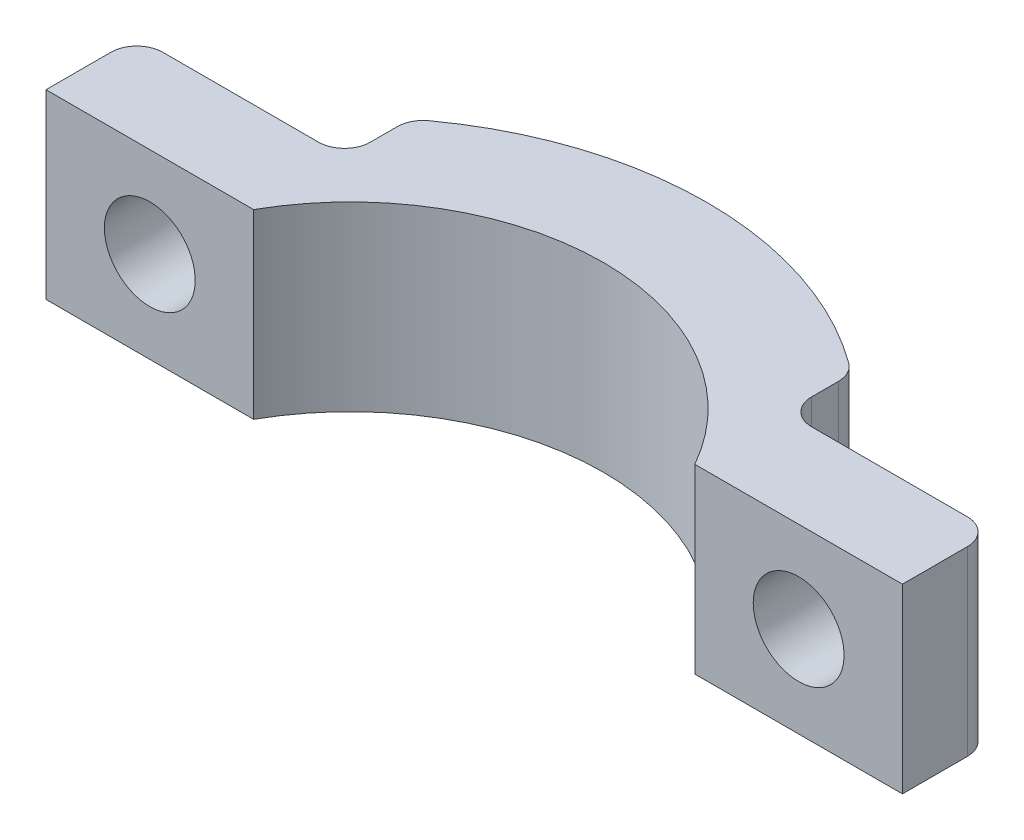
ISO-10303-21;
HEADER;
FILE_DESCRIPTION(('STEP AP214'),'2;1');
FILE_NAME('part.step','',(''),(''),'','','');
FILE_SCHEMA(('AUTOMOTIVE_DESIGN { 1 0 10303 214 1 1 1 1 }'));
ENDSEC;
DATA;
#1=APPLICATION_CONTEXT('core data for automotive mechanical design processes');
#2=APPLICATION_PROTOCOL_DEFINITION('international standard','automotive_design',2000,#1);
#3=PRODUCT_CONTEXT('',#1,'mechanical');
#4=PRODUCT('Part','Part','',(#3));
#5=PRODUCT_RELATED_PRODUCT_CATEGORY('part','',(#4));
#6=PRODUCT_DEFINITION_FORMATION('','',#4);
#7=PRODUCT_DEFINITION_CONTEXT('part definition',#1,'design');
#8=PRODUCT_DEFINITION('design','',#6,#7);
#9=PRODUCT_DEFINITION_SHAPE('','',#8);
#10=(LENGTH_UNIT() NAMED_UNIT(*) SI_UNIT(.MILLI.,.METRE.));
#11=(NAMED_UNIT(*) PLANE_ANGLE_UNIT() SI_UNIT($,.RADIAN.));
#12=(NAMED_UNIT(*) SI_UNIT($,.STERADIAN.) SOLID_ANGLE_UNIT());
#13=UNCERTAINTY_MEASURE_WITH_UNIT(LENGTH_MEASURE(1.E-05),#10,'distance_accuracy_value','');
#14=(GEOMETRIC_REPRESENTATION_CONTEXT(3) GLOBAL_UNCERTAINTY_ASSIGNED_CONTEXT((#13)) GLOBAL_UNIT_ASSIGNED_CONTEXT((#10,
#11,#12)) REPRESENTATION_CONTEXT('',''));
#15=CARTESIAN_POINT('',(0.,0.,0.));
#16=DIRECTION('',(0.,0.,1.));
#17=DIRECTION('',(1.,0.,0.));
#18=AXIS2_PLACEMENT_3D('',#15,#16,#17);
#19=CARTESIAN_POINT('',(8.5,7.,4.7762432936357));
#20=DIRECTION('',(0.,-1.,0.));
#21=DIRECTION('',(0.,0.,-1.));
#22=AXIS2_PLACEMENT_3D('',#19,#20,#21);
#23=CYLINDRICAL_SURFACE('',#22,9.75);
#24=CARTESIAN_POINT('',(8.5,0.,4.7762432936357));
#25=DIRECTION('',(0.,-1.,0.));
#26=DIRECTION('',(0.,0.,-1.));
#27=AXIS2_PLACEMENT_3D('',#24,#25,#26);
#28=CIRCLE('',#27,9.75);
#29=CARTESIAN_POINT('',(0.,0.,0.));
#30=VERTEX_POINT('',#29);
#31=CARTESIAN_POINT('',(17.,0.,0.));
#32=VERTEX_POINT('',#31);
#33=EDGE_CURVE('E176',#30,#32,#28,.T.);
#34=ORIENTED_EDGE('',*,*,#33,.T.);
#35=DIRECTION('',(0.,-1.,0.));
#36=VECTOR('',#35,1.);
#37=CARTESIAN_POINT('',(17.,7.,0.));
#38=LINE('',#37,#36);
#39=CARTESIAN_POINT('',(17.,7.,0.));
#40=VERTEX_POINT('',#39);
#41=EDGE_CURVE('E158',#40,#32,#38,.T.);
#42=ORIENTED_EDGE('',*,*,#41,.F.);
#43=CARTESIAN_POINT('',(8.5,7.,4.7762432936357));
#44=DIRECTION('',(0.,-1.,0.));
#45=DIRECTION('',(0.,0.,-1.));
#46=AXIS2_PLACEMENT_3D('',#43,#44,#45);
#47=CIRCLE('',#46,9.75);
#48=CARTESIAN_POINT('',(0.,7.,0.));
#49=VERTEX_POINT('',#48);
#50=EDGE_CURVE('E163',#49,#40,#47,.T.);
#51=ORIENTED_EDGE('',*,*,#50,.F.);
#52=DIRECTION('',(0.,-1.,0.));
#53=VECTOR('',#52,1.);
#54=CARTESIAN_POINT('',(0.,7.,0.));
#55=LINE('',#54,#53);
#56=EDGE_CURVE('E271',#49,#30,#55,.T.);
#57=ORIENTED_EDGE('',*,*,#56,.T.);
#58=EDGE_LOOP('',(#34,#42,#51,#57));
#59=FACE_BOUND('',#58,.T.);
#60=ADVANCED_FACE('F39',(#59),#23,.F.);
#61=CARTESIAN_POINT('',(25.,7.,0.));
#62=DIRECTION('',(0.,0.,-1.));
#63=DIRECTION('',(-1.,0.,0.));
#64=AXIS2_PLACEMENT_3D('',#61,#62,#63);
#65=PLANE('',#64);
#66=CARTESIAN_POINT('',(20.9999912144734,3.5,0.));
#67=DIRECTION('',(0.,0.,-1.));
#68=DIRECTION('',(-1.,0.,0.));
#69=AXIS2_PLACEMENT_3D('',#66,#67,#68);
#70=CIRCLE('',#69,1.75);
#71=CARTESIAN_POINT('',(19.2499912144734,3.5,0.));
#72=VERTEX_POINT('',#71);
#73=EDGE_CURVE('E295',#72,#72,#70,.F.);
#74=ORIENTED_EDGE('',*,*,#73,.F.);
#75=EDGE_LOOP('',(#74));
#76=FACE_BOUND('',#75,.T.);
#77=DIRECTION('',(1.,0.,0.));
#78=VECTOR('',#77,1.);
#79=CARTESIAN_POINT('',(25.,0.,0.));
#80=LINE('',#79,#78);
#81=CARTESIAN_POINT('',(25.,0.,0.));
#82=VERTEX_POINT('',#81);
#83=EDGE_CURVE('E262',#32,#82,#80,.T.);
#84=ORIENTED_EDGE('',*,*,#83,.T.);
#85=DIRECTION('',(0.,-1.,0.));
#86=VECTOR('',#85,1.);
#87=CARTESIAN_POINT('',(25.,7.,0.));
#88=LINE('',#87,#86);
#89=CARTESIAN_POINT('',(25.,7.,0.));
#90=VERTEX_POINT('',#89);
#91=EDGE_CURVE('E161',#90,#82,#88,.T.);
#92=ORIENTED_EDGE('',*,*,#91,.F.);
#93=DIRECTION('',(1.,0.,0.));
#94=VECTOR('',#93,1.);
#95=CARTESIAN_POINT('',(25.,7.,0.));
#96=LINE('',#95,#94);
#97=EDGE_CURVE('E154',#40,#90,#96,.T.);
#98=ORIENTED_EDGE('',*,*,#97,.F.);
#99=ORIENTED_EDGE('',*,*,#41,.T.);
#100=EDGE_LOOP('',(#84,#92,#98,#99));
#101=FACE_BOUND('',#100,.T.);
#102=ADVANCED_FACE('F156',(#76,#101),#65,.F.);
#103=CARTESIAN_POINT('',(25.,7.,0.));
#104=DIRECTION('',(-1.,0.,0.));
#105=DIRECTION('',(0.,0.,1.));
#106=AXIS2_PLACEMENT_3D('',#103,#104,#105);
#107=PLANE('',#106);
#108=DIRECTION('',(0.,0.,-1.));
#109=VECTOR('',#108,1.);
#110=CARTESIAN_POINT('',(25.,0.,0.));
#111=LINE('',#110,#109);
#112=CARTESIAN_POINT('',(25.,0.,-2.5));
#113=VERTEX_POINT('',#112);
#114=EDGE_CURVE('E257',#82,#113,#111,.T.);
#115=ORIENTED_EDGE('',*,*,#114,.T.);
#116=DIRECTION('',(0.,-1.,0.));
#117=VECTOR('',#116,1.);
#118=CARTESIAN_POINT('',(25.,7.,-2.5));
#119=LINE('',#118,#117);
#120=CARTESIAN_POINT('',(25.,7.,-2.5));
#121=VERTEX_POINT('',#120);
#122=EDGE_CURVE('E54',#113,#121,#119,.F.);
#123=ORIENTED_EDGE('',*,*,#122,.T.);
#124=DIRECTION('',(0.,0.,-1.));
#125=VECTOR('',#124,1.);
#126=CARTESIAN_POINT('',(25.,7.,0.));
#127=LINE('',#126,#125);
#128=EDGE_CURVE('E162',#90,#121,#127,.T.);
#129=ORIENTED_EDGE('',*,*,#128,.F.);
#130=ORIENTED_EDGE('',*,*,#91,.T.);
#131=EDGE_LOOP('',(#115,#123,#129,#130));
#132=FACE_BOUND('',#131,.T.);
#133=ADVANCED_FACE('F315',(#132),#107,.F.);
#134=CARTESIAN_POINT('',(25.,7.,-3.5));
#135=DIRECTION('',(0.,0.,1.));
#136=DIRECTION('',(1.,0.,0.));
#137=AXIS2_PLACEMENT_3D('',#134,#135,#136);
#138=PLANE('',#137);
#139=CARTESIAN_POINT('',(20.9999912144734,3.5,-3.5));
#140=DIRECTION('',(0.,0.,-1.));
#141=DIRECTION('',(-1.,0.,0.));
#142=AXIS2_PLACEMENT_3D('',#139,#140,#141);
#143=CIRCLE('',#142,1.75);
#144=CARTESIAN_POINT('',(19.2499912144734,3.5,-3.5));
#145=VERTEX_POINT('',#144);
#146=EDGE_CURVE('E301',#145,#145,#143,.T.);
#147=ORIENTED_EDGE('',*,*,#146,.F.);
#148=EDGE_LOOP('',(#147));
#149=FACE_BOUND('',#148,.T.);
#150=DIRECTION('',(-1.,0.,0.));
#151=VECTOR('',#150,1.);
#152=CARTESIAN_POINT('',(25.,7.,-3.5));
#153=LINE('',#152,#151);
#154=CARTESIAN_POINT('',(24.,7.,-3.5));
#155=VERTEX_POINT('',#154);
#156=CARTESIAN_POINT('',(18.,7.,-3.5));
#157=VERTEX_POINT('',#156);
#158=EDGE_CURVE('E235',#155,#157,#153,.T.);
#159=ORIENTED_EDGE('',*,*,#158,.F.);
#160=DIRECTION('',(0.,-1.,0.));
#161=VECTOR('',#160,1.);
#162=CARTESIAN_POINT('',(24.,7.,-3.5));
#163=LINE('',#162,#161);
#164=CARTESIAN_POINT('',(24.,0.,-3.5));
#165=VERTEX_POINT('',#164);
#166=EDGE_CURVE('E208',#155,#165,#163,.T.);
#167=ORIENTED_EDGE('',*,*,#166,.T.);
#168=DIRECTION('',(-1.,0.,0.));
#169=VECTOR('',#168,1.);
#170=CARTESIAN_POINT('',(25.,0.,-3.5));
#171=LINE('',#170,#169);
#172=CARTESIAN_POINT('',(18.,0.,-3.5));
#173=VERTEX_POINT('',#172);
#174=EDGE_CURVE('E252',#165,#173,#171,.T.);
#175=ORIENTED_EDGE('',*,*,#174,.T.);
#176=DIRECTION('',(0.,1.,0.));
#177=VECTOR('',#176,1.);
#178=CARTESIAN_POINT('',(18.,7.,-3.5));
#179=LINE('',#178,#177);
#180=EDGE_CURVE('E205',#173,#157,#179,.T.);
#181=ORIENTED_EDGE('',*,*,#180,.T.);
#182=EDGE_LOOP('',(#159,#167,#175,#181));
#183=FACE_BOUND('',#182,.T.);
#184=ADVANCED_FACE('F254',(#149,#183),#138,.F.);
#185=CARTESIAN_POINT('',(8.5,7.,4.7762432936357));
#186=DIRECTION('',(0.,-1.,0.));
#187=DIRECTION('',(0.,0.,-1.));
#188=AXIS2_PLACEMENT_3D('',#185,#186,#187);
#189=CYLINDRICAL_SURFACE('',#188,13.75);
#190=CARTESIAN_POINT('',(8.5,7.,4.7762432936357));
#191=DIRECTION('',(0.,1.,0.));
#192=DIRECTION('',(0.,0.,1.));
#193=AXIS2_PLACEMENT_3D('',#190,#191,#192);
#194=CIRCLE('',#193,13.75);
#195=CARTESIAN_POINT('',(16.5882352941176,7.,-6.34324184853657));
#196=VERTEX_POINT('',#195);
#197=CARTESIAN_POINT('',(0.411764705882358,7.,-6.34324184853656));
#198=VERTEX_POINT('',#197);
#199=EDGE_CURVE('E287',#196,#198,#194,.T.);
#200=ORIENTED_EDGE('',*,*,#199,.F.);
#201=DIRECTION('',(0.,-1.,0.));
#202=VECTOR('',#201,1.);
#203=CARTESIAN_POINT('',(16.5882352941176,7.,-6.34324184853656));
#204=LINE('',#203,#202);
#205=CARTESIAN_POINT('',(16.5882352941176,0.,-6.34324184853657));
#206=VERTEX_POINT('',#205);
#207=EDGE_CURVE('E215',#196,#206,#204,.T.);
#208=ORIENTED_EDGE('',*,*,#207,.T.);
#209=CARTESIAN_POINT('',(8.5,0.,4.7762432936357));
#210=DIRECTION('',(0.,1.,0.));
#211=DIRECTION('',(0.,0.,1.));
#212=AXIS2_PLACEMENT_3D('',#209,#210,#211);
#213=CIRCLE('',#212,13.75);
#214=CARTESIAN_POINT('',(0.411764705882358,0.,-6.34324184853656));
#215=VERTEX_POINT('',#214);
#216=EDGE_CURVE('E256',#206,#215,#213,.T.);
#217=ORIENTED_EDGE('',*,*,#216,.T.);
#218=DIRECTION('',(0.,-1.,0.));
#219=VECTOR('',#218,1.);
#220=CARTESIAN_POINT('',(0.411764705882358,7.,-6.34324184853656));
#221=LINE('',#220,#219);
#222=EDGE_CURVE('E212',#215,#198,#221,.F.);
#223=ORIENTED_EDGE('',*,*,#222,.T.);
#224=EDGE_LOOP('',(#200,#208,#217,#223));
#225=FACE_BOUND('',#224,.T.);
#226=ADVANCED_FACE('F314',(#225),#189,.T.);
#227=CARTESIAN_POINT('',(-8.,7.,-3.5));
#228=DIRECTION('',(0.,0.,1.));
#229=DIRECTION('',(1.,0.,0.));
#230=AXIS2_PLACEMENT_3D('',#227,#228,#229);
#231=PLANE('',#230);
#232=CARTESIAN_POINT('',(-4.00000636193233,3.51100816552135,-3.5));
#233=DIRECTION('',(0.,0.,-1.));
#234=DIRECTION('',(-1.,0.,0.));
#235=AXIS2_PLACEMENT_3D('',#232,#233,#234);
#236=CIRCLE('',#235,1.75);
#237=CARTESIAN_POINT('',(-5.75000636193233,3.51100816552135,-3.5));
#238=VERTEX_POINT('',#237);
#239=EDGE_CURVE('E298',#238,#238,#236,.T.);
#240=ORIENTED_EDGE('',*,*,#239,.F.);
#241=EDGE_LOOP('',(#240));
#242=FACE_BOUND('',#241,.T.);
#243=DIRECTION('',(-1.,0.,0.));
#244=VECTOR('',#243,1.);
#245=CARTESIAN_POINT('',(-8.,0.,-3.5));
#246=LINE('',#245,#244);
#247=CARTESIAN_POINT('',(-0.999999999999997,0.,-3.5));
#248=VERTEX_POINT('',#247);
#249=CARTESIAN_POINT('',(-7.,0.,-3.5));
#250=VERTEX_POINT('',#249);
#251=EDGE_CURVE('E260',#248,#250,#246,.T.);
#252=ORIENTED_EDGE('',*,*,#251,.T.);
#253=DIRECTION('',(0.,-1.,0.));
#254=VECTOR('',#253,1.);
#255=CARTESIAN_POINT('',(-7.,7.,-3.5));
#256=LINE('',#255,#254);
#257=CARTESIAN_POINT('',(-7.,7.,-3.5));
#258=VERTEX_POINT('',#257);
#259=EDGE_CURVE('E196',#250,#258,#256,.F.);
#260=ORIENTED_EDGE('',*,*,#259,.T.);
#261=DIRECTION('',(-1.,0.,0.));
#262=VECTOR('',#261,1.);
#263=CARTESIAN_POINT('',(-8.,7.,-3.5));
#264=LINE('',#263,#262);
#265=CARTESIAN_POINT('',(-0.999999999999997,7.,-3.5));
#266=VERTEX_POINT('',#265);
#267=EDGE_CURVE('E285',#266,#258,#264,.T.);
#268=ORIENTED_EDGE('',*,*,#267,.F.);
#269=DIRECTION('',(0.,-1.,0.));
#270=VECTOR('',#269,1.);
#271=CARTESIAN_POINT('',(-0.999999999999997,0.,-3.5));
#272=LINE('',#271,#270);
#273=EDGE_CURVE('E193',#266,#248,#272,.T.);
#274=ORIENTED_EDGE('',*,*,#273,.T.);
#275=EDGE_LOOP('',(#252,#260,#268,#274));
#276=FACE_BOUND('',#275,.T.);
#277=ADVANCED_FACE('F321',(#242,#276),#231,.F.);
#278=CARTESIAN_POINT('',(-8.,7.,0.));
#279=DIRECTION('',(1.,0.,0.));
#280=DIRECTION('',(0.,0.,-1.));
#281=AXIS2_PLACEMENT_3D('',#278,#279,#280);
#282=PLANE('',#281);
#283=DIRECTION('',(0.,0.,1.));
#284=VECTOR('',#283,1.);
#285=CARTESIAN_POINT('',(-8.,7.,0.));
#286=LINE('',#285,#284);
#287=CARTESIAN_POINT('',(-8.,7.,-2.5));
#288=VERTEX_POINT('',#287);
#289=CARTESIAN_POINT('',(-8.,7.,0.));
#290=VERTEX_POINT('',#289);
#291=EDGE_CURVE('E283',#288,#290,#286,.T.);
#292=ORIENTED_EDGE('',*,*,#291,.F.);
#293=DIRECTION('',(0.,-1.,0.));
#294=VECTOR('',#293,1.);
#295=CARTESIAN_POINT('',(-8.,7.,-2.5));
#296=LINE('',#295,#294);
#297=CARTESIAN_POINT('',(-8.,0.,-2.5));
#298=VERTEX_POINT('',#297);
#299=EDGE_CURVE('E177',#288,#298,#296,.T.);
#300=ORIENTED_EDGE('',*,*,#299,.T.);
#301=DIRECTION('',(0.,0.,1.));
#302=VECTOR('',#301,1.);
#303=CARTESIAN_POINT('',(-8.,0.,0.));
#304=LINE('',#303,#302);
#305=CARTESIAN_POINT('',(-8.,0.,0.));
#306=VERTEX_POINT('',#305);
#307=EDGE_CURVE('E268',#298,#306,#304,.T.);
#308=ORIENTED_EDGE('',*,*,#307,.T.);
#309=DIRECTION('',(0.,-1.,0.));
#310=VECTOR('',#309,1.);
#311=CARTESIAN_POINT('',(-8.,7.,0.));
#312=LINE('',#311,#310);
#313=EDGE_CURVE('E182',#290,#306,#312,.T.);
#314=ORIENTED_EDGE('',*,*,#313,.F.);
#315=EDGE_LOOP('',(#292,#300,#308,#314));
#316=FACE_BOUND('',#315,.T.);
#317=ADVANCED_FACE('F363',(#316),#282,.F.);
#318=CARTESIAN_POINT('',(0.,7.,0.));
#319=DIRECTION('',(0.,0.,-1.));
#320=DIRECTION('',(-1.,0.,0.));
#321=AXIS2_PLACEMENT_3D('',#318,#319,#320);
#322=PLANE('',#321);
#323=CARTESIAN_POINT('',(-4.00000636193233,3.51100816552135,0.));
#324=DIRECTION('',(0.,0.,-1.));
#325=DIRECTION('',(-1.,0.,0.));
#326=AXIS2_PLACEMENT_3D('',#323,#324,#325);
#327=CIRCLE('',#326,1.75);
#328=CARTESIAN_POINT('',(-5.75000636193233,3.51100816552135,0.));
#329=VERTEX_POINT('',#328);
#330=EDGE_CURVE('E302',#329,#329,#327,.F.);
#331=ORIENTED_EDGE('',*,*,#330,.F.);
#332=EDGE_LOOP('',(#331));
#333=FACE_BOUND('',#332,.T.);
#334=DIRECTION('',(1.,0.,0.));
#335=VECTOR('',#334,1.);
#336=CARTESIAN_POINT('',(0.,0.,0.));
#337=LINE('',#336,#335);
#338=EDGE_CURVE('E173',#306,#30,#337,.T.);
#339=ORIENTED_EDGE('',*,*,#338,.T.);
#340=ORIENTED_EDGE('',*,*,#56,.F.);
#341=DIRECTION('',(1.,0.,0.));
#342=VECTOR('',#341,1.);
#343=CARTESIAN_POINT('',(0.,7.,0.));
#344=LINE('',#343,#342);
#345=EDGE_CURVE('E169',#290,#49,#344,.T.);
#346=ORIENTED_EDGE('',*,*,#345,.F.);
#347=ORIENTED_EDGE('',*,*,#313,.T.);
#348=EDGE_LOOP('',(#339,#340,#346,#347));
#349=FACE_BOUND('',#348,.T.);
#350=ADVANCED_FACE('F276',(#333,#349),#322,.F.);
#351=CARTESIAN_POINT('',(8.5,7.,4.7762432936357));
#352=DIRECTION('',(0.,-1.,0.));
#353=DIRECTION('',(0.,0.,-1.));
#354=AXIS2_PLACEMENT_3D('',#351,#352,#353);
#355=PLANE('',#354);
#356=ORIENTED_EDGE('',*,*,#267,.T.);
#357=CARTESIAN_POINT('',(-7.,7.,-2.5));
#358=DIRECTION('',(0.,-1.,0.));
#359=DIRECTION('',(0.,0.,-1.));
#360=AXIS2_PLACEMENT_3D('',#357,#358,#359);
#361=CIRCLE('',#360,1.);
#362=EDGE_CURVE('E203',#258,#288,#361,.F.);
#363=ORIENTED_EDGE('',*,*,#362,.T.);
#364=ORIENTED_EDGE('',*,*,#291,.T.);
#365=ORIENTED_EDGE('',*,*,#345,.T.);
#366=ORIENTED_EDGE('',*,*,#50,.T.);
#367=ORIENTED_EDGE('',*,*,#97,.T.);
#368=ORIENTED_EDGE('',*,*,#128,.T.);
#369=CARTESIAN_POINT('',(24.,7.,-2.5));
#370=DIRECTION('',(0.,-1.,0.));
#371=DIRECTION('',(0.,0.,-1.));
#372=AXIS2_PLACEMENT_3D('',#369,#370,#371);
#373=CIRCLE('',#372,1.);
#374=EDGE_CURVE('E201',#121,#155,#373,.F.);
#375=ORIENTED_EDGE('',*,*,#374,.T.);
#376=ORIENTED_EDGE('',*,*,#158,.T.);
#377=CARTESIAN_POINT('',(18.,7.,-4.5));
#378=DIRECTION('',(0.,-1.,0.));
#379=DIRECTION('',(0.,0.,-1.));
#380=AXIS2_PLACEMENT_3D('',#377,#378,#379);
#381=CIRCLE('',#380,1.);
#382=CARTESIAN_POINT('',(17.,7.,-4.5));
#383=VERTEX_POINT('',#382);
#384=EDGE_CURVE('E47',#157,#383,#381,.T.);
#385=ORIENTED_EDGE('',*,*,#384,.T.);
#386=DIRECTION('',(0.,0.,-1.));
#387=VECTOR('',#386,1.);
#388=CARTESIAN_POINT('',(17.,7.,7.13014581273465));
#389=LINE('',#388,#387);
#390=CARTESIAN_POINT('',(17.,7.,-5.53455202001495));
#391=VERTEX_POINT('',#390);
#392=EDGE_CURVE('E232',#383,#391,#389,.T.);
#393=ORIENTED_EDGE('',*,*,#392,.T.);
#394=CARTESIAN_POINT('',(16.,7.,-5.53455202001495));
#395=DIRECTION('',(0.,-1.,0.));
#396=DIRECTION('',(0.,0.,-1.));
#397=AXIS2_PLACEMENT_3D('',#394,#395,#396);
#398=CIRCLE('',#397,1.);
#399=EDGE_CURVE('E199',#391,#196,#398,.F.);
#400=ORIENTED_EDGE('',*,*,#399,.T.);
#401=ORIENTED_EDGE('',*,*,#199,.T.);
#402=CARTESIAN_POINT('',(1.,7.,-5.53455202001494));
#403=DIRECTION('',(0.,-1.,0.));
#404=DIRECTION('',(0.,0.,-1.));
#405=AXIS2_PLACEMENT_3D('',#402,#403,#404);
#406=CIRCLE('',#405,1.);
#407=CARTESIAN_POINT('',(0.,7.,-5.53455202001494));
#408=VERTEX_POINT('',#407);
#409=EDGE_CURVE('E62',#198,#408,#406,.F.);
#410=ORIENTED_EDGE('',*,*,#409,.T.);
#411=DIRECTION('',(0.,0.,-1.));
#412=VECTOR('',#411,1.);
#413=CARTESIAN_POINT('',(0.,7.,7.13014581273465));
#414=LINE('',#413,#412);
#415=CARTESIAN_POINT('',(0.,7.,-4.5));
#416=VERTEX_POINT('',#415);
#417=EDGE_CURVE('E294',#416,#408,#414,.T.);
#418=ORIENTED_EDGE('',*,*,#417,.F.);
#419=CARTESIAN_POINT('',(-0.999999999999997,7.,-4.5));
#420=DIRECTION('',(0.,-1.,0.));
#421=DIRECTION('',(0.,0.,-1.));
#422=AXIS2_PLACEMENT_3D('',#419,#420,#421);
#423=CIRCLE('',#422,1.);
#424=EDGE_CURVE('E228',#416,#266,#423,.T.);
#425=ORIENTED_EDGE('',*,*,#424,.T.);
#426=EDGE_LOOP('',(#356,#363,#364,#365,#366,#367,#368,#375,#376,#385,#393,#400,#401,#410,#418,#425));
#427=FACE_BOUND('',#426,.T.);
#428=ADVANCED_FACE('F167',(#427),#355,.F.);
#429=CARTESIAN_POINT('',(8.5,0.,4.7762432936357));
#430=DIRECTION('',(0.,-1.,0.));
#431=DIRECTION('',(0.,0.,-1.));
#432=AXIS2_PLACEMENT_3D('',#429,#430,#431);
#433=PLANE('',#432);
#434=ORIENTED_EDGE('',*,*,#307,.F.);
#435=CARTESIAN_POINT('',(-7.,0.,-2.5));
#436=DIRECTION('',(0.,-1.,0.));
#437=DIRECTION('',(0.,0.,-1.));
#438=AXIS2_PLACEMENT_3D('',#435,#436,#437);
#439=CIRCLE('',#438,1.);
#440=EDGE_CURVE('E191',#298,#250,#439,.T.);
#441=ORIENTED_EDGE('',*,*,#440,.T.);
#442=ORIENTED_EDGE('',*,*,#251,.F.);
#443=CARTESIAN_POINT('',(-0.999999999999997,0.,-4.5));
#444=DIRECTION('',(0.,-1.,0.));
#445=DIRECTION('',(0.,0.,-1.));
#446=AXIS2_PLACEMENT_3D('',#443,#444,#445);
#447=CIRCLE('',#446,1.);
#448=CARTESIAN_POINT('',(0.,0.,-4.5));
#449=VERTEX_POINT('',#448);
#450=EDGE_CURVE('E226',#248,#449,#447,.F.);
#451=ORIENTED_EDGE('',*,*,#450,.T.);
#452=DIRECTION('',(0.,0.,-1.));
#453=VECTOR('',#452,1.);
#454=CARTESIAN_POINT('',(0.,0.,7.13014581273465));
#455=LINE('',#454,#453);
#456=CARTESIAN_POINT('',(0.,0.,-5.53455202001494));
#457=VERTEX_POINT('',#456);
#458=EDGE_CURVE('E291',#449,#457,#455,.T.);
#459=ORIENTED_EDGE('',*,*,#458,.T.);
#460=CARTESIAN_POINT('',(1.,0.,-5.53455202001494));
#461=DIRECTION('',(0.,-1.,0.));
#462=DIRECTION('',(0.,0.,-1.));
#463=AXIS2_PLACEMENT_3D('',#460,#461,#462);
#464=CIRCLE('',#463,1.);
#465=EDGE_CURVE('E180',#457,#215,#464,.T.);
#466=ORIENTED_EDGE('',*,*,#465,.T.);
#467=ORIENTED_EDGE('',*,*,#216,.F.);
#468=CARTESIAN_POINT('',(16.,0.,-5.53455202001495));
#469=DIRECTION('',(0.,-1.,0.));
#470=DIRECTION('',(0.,0.,-1.));
#471=AXIS2_PLACEMENT_3D('',#468,#469,#470);
#472=CIRCLE('',#471,1.);
#473=CARTESIAN_POINT('',(17.,0.,-5.53455202001495));
#474=VERTEX_POINT('',#473);
#475=EDGE_CURVE('E187',#206,#474,#472,.T.);
#476=ORIENTED_EDGE('',*,*,#475,.T.);
#477=DIRECTION('',(0.,0.,-1.));
#478=VECTOR('',#477,1.);
#479=CARTESIAN_POINT('',(17.,0.,7.13014581273465));
#480=LINE('',#479,#478);
#481=CARTESIAN_POINT('',(17.,0.,-4.5));
#482=VERTEX_POINT('',#481);
#483=EDGE_CURVE('E244',#482,#474,#480,.T.);
#484=ORIENTED_EDGE('',*,*,#483,.F.);
#485=CARTESIAN_POINT('',(18.,0.,-4.5));
#486=DIRECTION('',(0.,-1.,0.));
#487=DIRECTION('',(0.,0.,-1.));
#488=AXIS2_PLACEMENT_3D('',#485,#486,#487);
#489=CIRCLE('',#488,1.);
#490=EDGE_CURVE('E11',#482,#173,#489,.F.);
#491=ORIENTED_EDGE('',*,*,#490,.T.);
#492=ORIENTED_EDGE('',*,*,#174,.F.);
#493=CARTESIAN_POINT('',(24.,0.,-2.5));
#494=DIRECTION('',(0.,-1.,0.));
#495=DIRECTION('',(0.,0.,-1.));
#496=AXIS2_PLACEMENT_3D('',#493,#494,#495);
#497=CIRCLE('',#496,1.);
#498=EDGE_CURVE('E189',#165,#113,#497,.T.);
#499=ORIENTED_EDGE('',*,*,#498,.T.);
#500=ORIENTED_EDGE('',*,*,#114,.F.);
#501=ORIENTED_EDGE('',*,*,#83,.F.);
#502=ORIENTED_EDGE('',*,*,#33,.F.);
#503=ORIENTED_EDGE('',*,*,#338,.F.);
#504=EDGE_LOOP('',(#434,#441,#442,#451,#459,#466,#467,#476,#484,#491,#492,#499,#500,#501,#502,#503));
#505=FACE_BOUND('',#504,.T.);
#506=ADVANCED_FACE('F251',(#505),#433,.T.);
#507=CARTESIAN_POINT('',(0.,7.,7.13014581273465));
#508=DIRECTION('',(1.,0.,0.));
#509=DIRECTION('',(0.,0.,-1.));
#510=AXIS2_PLACEMENT_3D('',#507,#508,#509);
#511=PLANE('',#510);
#512=ORIENTED_EDGE('',*,*,#417,.T.);
#513=DIRECTION('',(0.,-1.,0.));
#514=VECTOR('',#513,1.);
#515=CARTESIAN_POINT('',(0.,7.,-5.53455202001494));
#516=LINE('',#515,#514);
#517=EDGE_CURVE('E224',#408,#457,#516,.T.);
#518=ORIENTED_EDGE('',*,*,#517,.T.);
#519=ORIENTED_EDGE('',*,*,#458,.F.);
#520=DIRECTION('',(0.,-1.,0.));
#521=VECTOR('',#520,1.);
#522=CARTESIAN_POINT('',(0.,7.,-4.5));
#523=LINE('',#522,#521);
#524=EDGE_CURVE('E222',#449,#416,#523,.F.);
#525=ORIENTED_EDGE('',*,*,#524,.T.);
#526=EDGE_LOOP('',(#512,#518,#519,#525));
#527=FACE_BOUND('',#526,.T.);
#528=ADVANCED_FACE('F378',(#527),#511,.F.);
#529=CARTESIAN_POINT('',(17.,7.,7.13014581273465));
#530=DIRECTION('',(-1.,0.,0.));
#531=DIRECTION('',(0.,0.,1.));
#532=AXIS2_PLACEMENT_3D('',#529,#530,#531);
#533=PLANE('',#532);
#534=ORIENTED_EDGE('',*,*,#483,.T.);
#535=DIRECTION('',(0.,-1.,0.));
#536=VECTOR('',#535,1.);
#537=CARTESIAN_POINT('',(17.,7.,-5.53455202001495));
#538=LINE('',#537,#536);
#539=EDGE_CURVE('E220',#474,#391,#538,.F.);
#540=ORIENTED_EDGE('',*,*,#539,.T.);
#541=ORIENTED_EDGE('',*,*,#392,.F.);
#542=DIRECTION('',(0.,1.,0.));
#543=VECTOR('',#542,1.);
#544=CARTESIAN_POINT('',(17.,0.,-4.5));
#545=LINE('',#544,#543);
#546=EDGE_CURVE('E218',#383,#482,#545,.F.);
#547=ORIENTED_EDGE('',*,*,#546,.T.);
#548=EDGE_LOOP('',(#534,#540,#541,#547));
#549=FACE_BOUND('',#548,.T.);
#550=ADVANCED_FACE('F241',(#549),#533,.F.);
#551=CARTESIAN_POINT('',(-4.00000636193233,3.51100816552135,0.00100000000000013));
#552=DIRECTION('',(0.,0.,-1.));
#553=DIRECTION('',(-1.,0.,0.));
#554=AXIS2_PLACEMENT_3D('',#551,#552,#553);
#555=CYLINDRICAL_SURFACE('',#554,1.75);
#556=CARTESIAN_POINT('',(-5.75000636193233,3.51100816552135,-3.5));
#557=CARTESIAN_POINT('',(-5.75000636193233,3.51100816552135,-3.46354166666667));
#558=CARTESIAN_POINT('',(-5.75000636193233,3.51100816552135,-3.42708333333333));
#559=CARTESIAN_POINT('',(-5.75000636193233,3.51100816552135,-3.35416666666667));
#560=CARTESIAN_POINT('',(-5.75000636193233,3.51100816552135,-3.31770833333333));
#561=CARTESIAN_POINT('',(-5.75000636193233,3.51100816552135,-3.24479166666667));
#562=CARTESIAN_POINT('',(-5.75000636193233,3.51100816552135,-3.20833333333333));
#563=CARTESIAN_POINT('',(-5.75000636193233,3.51100816552135,-3.13541666666667));
#564=CARTESIAN_POINT('',(-5.75000636193233,3.51100816552135,-3.09895833333333));
#565=CARTESIAN_POINT('',(-5.75000636193233,3.51100816552135,-3.02604166666667));
#566=CARTESIAN_POINT('',(-5.75000636193233,3.51100816552135,-2.98958333333333));
#567=CARTESIAN_POINT('',(-5.75000636193233,3.51100816552135,-2.91666666666667));
#568=CARTESIAN_POINT('',(-5.75000636193233,3.51100816552135,-2.88020833333333));
#569=CARTESIAN_POINT('',(-5.75000636193233,3.51100816552135,-2.80729166666667));
#570=CARTESIAN_POINT('',(-5.75000636193233,3.51100816552135,-2.77083333333333));
#571=CARTESIAN_POINT('',(-5.75000636193233,3.51100816552135,-2.69791666666667));
#572=CARTESIAN_POINT('',(-5.75000636193233,3.51100816552135,-2.66145833333333));
#573=CARTESIAN_POINT('',(-5.75000636193233,3.51100816552135,-2.58854166666667));
#574=CARTESIAN_POINT('',(-5.75000636193233,3.51100816552135,-2.55208333333333));
#575=CARTESIAN_POINT('',(-5.75000636193233,3.51100816552135,-2.47916666666667));
#576=CARTESIAN_POINT('',(-5.75000636193233,3.51100816552135,-2.44270833333333));
#577=CARTESIAN_POINT('',(-5.75000636193233,3.51100816552135,-2.36979166666667));
#578=CARTESIAN_POINT('',(-5.75000636193233,3.51100816552135,-2.33333333333333));
#579=CARTESIAN_POINT('',(-5.75000636193233,3.51100816552135,-2.26041666666667));
#580=CARTESIAN_POINT('',(-5.75000636193233,3.51100816552135,-2.22395833333333));
#581=CARTESIAN_POINT('',(-5.75000636193233,3.51100816552135,-2.15104166666667));
#582=CARTESIAN_POINT('',(-5.75000636193233,3.51100816552135,-2.11458333333333));
#583=CARTESIAN_POINT('',(-5.75000636193233,3.51100816552135,-2.04166666666667));
#584=CARTESIAN_POINT('',(-5.75000636193233,3.51100816552135,-2.00520833333333));
#585=CARTESIAN_POINT('',(-5.75000636193233,3.51100816552135,-1.93229166666667));
#586=CARTESIAN_POINT('',(-5.75000636193233,3.51100816552135,-1.89583333333333));
#587=CARTESIAN_POINT('',(-5.75000636193233,3.51100816552135,-1.82291666666667));
#588=CARTESIAN_POINT('',(-5.75000636193233,3.51100816552135,-1.78645833333333));
#589=CARTESIAN_POINT('',(-5.75000636193233,3.51100816552135,-1.71354166666667));
#590=CARTESIAN_POINT('',(-5.75000636193233,3.51100816552135,-1.67708333333333));
#591=CARTESIAN_POINT('',(-5.75000636193233,3.51100816552135,-1.60416666666667));
#592=CARTESIAN_POINT('',(-5.75000636193233,3.51100816552135,-1.56770833333333));
#593=CARTESIAN_POINT('',(-5.75000636193233,3.51100816552135,-1.49479166666667));
#594=CARTESIAN_POINT('',(-5.75000636193233,3.51100816552135,-1.45833333333333));
#595=CARTESIAN_POINT('',(-5.75000636193233,3.51100816552135,-1.38541666666667));
#596=CARTESIAN_POINT('',(-5.75000636193233,3.51100816552135,-1.34895833333333));
#597=CARTESIAN_POINT('',(-5.75000636193233,3.51100816552135,-1.27604166666667));
#598=CARTESIAN_POINT('',(-5.75000636193233,3.51100816552135,-1.23958333333333));
#599=CARTESIAN_POINT('',(-5.75000636193233,3.51100816552135,-1.16666666666667));
#600=CARTESIAN_POINT('',(-5.75000636193233,3.51100816552135,-1.13020833333333));
#601=CARTESIAN_POINT('',(-5.75000636193233,3.51100816552135,-1.05729166666667));
#602=CARTESIAN_POINT('',(-5.75000636193233,3.51100816552135,-1.02083333333333));
#603=CARTESIAN_POINT('',(-5.75000636193233,3.51100816552135,-0.947916666666667));
#604=CARTESIAN_POINT('',(-5.75000636193233,3.51100816552135,-0.911458333333333));
#605=CARTESIAN_POINT('',(-5.75000636193233,3.51100816552135,-0.838541666666667));
#606=CARTESIAN_POINT('',(-5.75000636193233,3.51100816552135,-0.802083333333333));
#607=CARTESIAN_POINT('',(-5.75000636193233,3.51100816552135,-0.729166666666667));
#608=CARTESIAN_POINT('',(-5.75000636193233,3.51100816552135,-0.692708333333333));
#609=CARTESIAN_POINT('',(-5.75000636193233,3.51100816552135,-0.619791666666666));
#610=CARTESIAN_POINT('',(-5.75000636193233,3.51100816552135,-0.583333333333333));
#611=CARTESIAN_POINT('',(-5.75000636193233,3.51100816552135,-0.510416666666666));
#612=CARTESIAN_POINT('',(-5.75000636193233,3.51100816552135,-0.473958333333333));
#613=CARTESIAN_POINT('',(-5.75000636193233,3.51100816552135,-0.401041666666666));
#614=CARTESIAN_POINT('',(-5.75000636193233,3.51100816552135,-0.364583333333333));
#615=CARTESIAN_POINT('',(-5.75000636193233,3.51100816552135,-0.291666666666667));
#616=CARTESIAN_POINT('',(-5.75000636193233,3.51100816552135,-0.255208333333333));
#617=CARTESIAN_POINT('',(-5.75000636193233,3.51100816552135,-0.182291666666667));
#618=CARTESIAN_POINT('',(-5.75000636193233,3.51100816552135,-0.145833333333333));
#619=CARTESIAN_POINT('',(-5.75000636193233,3.51100816552135,-0.0729166666666664));
#620=CARTESIAN_POINT('',(-5.75000636193233,3.51100816552135,-0.0364583333333331));
#621=CARTESIAN_POINT('',(-5.75000636193233,3.51100816552135,0.));
#622=B_SPLINE_CURVE_WITH_KNOTS('',3,(#556,#557,#558,#559,#560,#561,#562,#563,#564,#565,#566,
#567,#568,#569,#570,#571,#572,#573,#574,#575,#576,#577,#578,#579,#580,#581,#582,#583,#584,#585,
#586,#587,#588,#589,#590,#591,#592,#593,#594,#595,#596,#597,#598,#599,#600,#601,#602,#603,#604,
#605,#606,#607,#608,#609,#610,#611,#612,#613,#614,#615,#616,#617,#618,#619,#620,#621),
.UNSPECIFIED.,.F.,.F.,(4,2,2,2,2,2,2,2,2,2,2,2,2,2,2,2,2,2,2,2,2,2,2,2,2,2,2,2,2,2,2,2,4),(0.,
0.109375,0.21875,0.328125,0.4375,0.546875,0.65625,0.765625,0.875,0.984375,1.09375,1.203125,
1.3125,1.421875,1.53125,1.640625,1.75,1.859375,1.96875,2.078125,2.1875,2.296875,2.40625,
2.515625,2.625,2.734375,2.84375,2.953125,3.0625,3.171875,3.28125,3.390625,3.5),.UNSPECIFIED.);
#623=EDGE_CURVE('BSEAM385',#238,#329,#622,.T.);
#624=ORIENTED_EDGE('',*,*,#239,.T.);
#625=ORIENTED_EDGE('',*,*,#330,.T.);
#626=ORIENTED_EDGE('',*,*,#623,.T.);
#627=ORIENTED_EDGE('',*,*,#623,.F.);
#628=EDGE_LOOP('',(#624,#626,#625,#627));
#629=FACE_BOUND('',#628,.T.);
#630=ADVANCED_FACE('F385',(#629),#555,.F.);
#631=CARTESIAN_POINT('',(20.9999912144734,3.5,0.0010000000000023));
#632=DIRECTION('',(0.,0.,-1.));
#633=DIRECTION('',(-1.,0.,0.));
#634=AXIS2_PLACEMENT_3D('',#631,#632,#633);
#635=CYLINDRICAL_SURFACE('',#634,1.75);
#636=CARTESIAN_POINT('',(19.2499912144734,3.5,-3.5));
#637=CARTESIAN_POINT('',(19.2499912144734,3.5,-3.46354166666666));
#638=CARTESIAN_POINT('',(19.2499912144734,3.5,-3.42708333333333));
#639=CARTESIAN_POINT('',(19.2499912144734,3.5,-3.35416666666666));
#640=CARTESIAN_POINT('',(19.2499912144734,3.5,-3.31770833333333));
#641=CARTESIAN_POINT('',(19.2499912144734,3.5,-3.24479166666666));
#642=CARTESIAN_POINT('',(19.2499912144734,3.5,-3.20833333333333));
#643=CARTESIAN_POINT('',(19.2499912144734,3.5,-3.13541666666666));
#644=CARTESIAN_POINT('',(19.2499912144734,3.5,-3.09895833333333));
#645=CARTESIAN_POINT('',(19.2499912144734,3.5,-3.02604166666666));
#646=CARTESIAN_POINT('',(19.2499912144734,3.5,-2.98958333333333));
#647=CARTESIAN_POINT('',(19.2499912144734,3.5,-2.91666666666667));
#648=CARTESIAN_POINT('',(19.2499912144734,3.5,-2.88020833333333));
#649=CARTESIAN_POINT('',(19.2499912144734,3.5,-2.80729166666667));
#650=CARTESIAN_POINT('',(19.2499912144734,3.5,-2.77083333333333));
#651=CARTESIAN_POINT('',(19.2499912144734,3.5,-2.69791666666666));
#652=CARTESIAN_POINT('',(19.2499912144734,3.5,-2.66145833333333));
#653=CARTESIAN_POINT('',(19.2499912144734,3.5,-2.58854166666667));
#654=CARTESIAN_POINT('',(19.2499912144734,3.5,-2.55208333333333));
#655=CARTESIAN_POINT('',(19.2499912144734,3.5,-2.47916666666667));
#656=CARTESIAN_POINT('',(19.2499912144734,3.5,-2.44270833333333));
#657=CARTESIAN_POINT('',(19.2499912144734,3.5,-2.36979166666667));
#658=CARTESIAN_POINT('',(19.2499912144734,3.5,-2.33333333333333));
#659=CARTESIAN_POINT('',(19.2499912144734,3.5,-2.26041666666667));
#660=CARTESIAN_POINT('',(19.2499912144734,3.5,-2.22395833333333));
#661=CARTESIAN_POINT('',(19.2499912144734,3.5,-2.15104166666667));
#662=CARTESIAN_POINT('',(19.2499912144734,3.5,-2.11458333333333));
#663=CARTESIAN_POINT('',(19.2499912144734,3.5,-2.04166666666667));
#664=CARTESIAN_POINT('',(19.2499912144734,3.5,-2.00520833333333));
#665=CARTESIAN_POINT('',(19.2499912144734,3.5,-1.93229166666667));
#666=CARTESIAN_POINT('',(19.2499912144734,3.5,-1.89583333333333));
#667=CARTESIAN_POINT('',(19.2499912144734,3.5,-1.82291666666667));
#668=CARTESIAN_POINT('',(19.2499912144734,3.5,-1.78645833333333));
#669=CARTESIAN_POINT('',(19.2499912144734,3.5,-1.71354166666667));
#670=CARTESIAN_POINT('',(19.2499912144734,3.5,-1.67708333333333));
#671=CARTESIAN_POINT('',(19.2499912144734,3.5,-1.60416666666667));
#672=CARTESIAN_POINT('',(19.2499912144734,3.5,-1.56770833333333));
#673=CARTESIAN_POINT('',(19.2499912144734,3.5,-1.49479166666667));
#674=CARTESIAN_POINT('',(19.2499912144734,3.5,-1.45833333333333));
#675=CARTESIAN_POINT('',(19.2499912144734,3.5,-1.38541666666667));
#676=CARTESIAN_POINT('',(19.2499912144734,3.5,-1.34895833333333));
#677=CARTESIAN_POINT('',(19.2499912144734,3.5,-1.27604166666667));
#678=CARTESIAN_POINT('',(19.2499912144734,3.5,-1.23958333333333));
#679=CARTESIAN_POINT('',(19.2499912144734,3.5,-1.16666666666667));
#680=CARTESIAN_POINT('',(19.2499912144734,3.5,-1.13020833333333));
#681=CARTESIAN_POINT('',(19.2499912144734,3.5,-1.05729166666667));
#682=CARTESIAN_POINT('',(19.2499912144734,3.5,-1.02083333333333));
#683=CARTESIAN_POINT('',(19.2499912144734,3.5,-0.947916666666666));
#684=CARTESIAN_POINT('',(19.2499912144734,3.5,-0.911458333333333));
#685=CARTESIAN_POINT('',(19.2499912144734,3.5,-0.838541666666666));
#686=CARTESIAN_POINT('',(19.2499912144734,3.5,-0.802083333333333));
#687=CARTESIAN_POINT('',(19.2499912144734,3.5,-0.729166666666667));
#688=CARTESIAN_POINT('',(19.2499912144734,3.5,-0.692708333333333));
#689=CARTESIAN_POINT('',(19.2499912144734,3.5,-0.619791666666666));
#690=CARTESIAN_POINT('',(19.2499912144734,3.5,-0.583333333333333));
#691=CARTESIAN_POINT('',(19.2499912144734,3.5,-0.510416666666666));
#692=CARTESIAN_POINT('',(19.2499912144734,3.5,-0.473958333333333));
#693=CARTESIAN_POINT('',(19.2499912144734,3.5,-0.401041666666667));
#694=CARTESIAN_POINT('',(19.2499912144734,3.5,-0.364583333333333));
#695=CARTESIAN_POINT('',(19.2499912144734,3.5,-0.291666666666667));
#696=CARTESIAN_POINT('',(19.2499912144734,3.5,-0.255208333333333));
#697=CARTESIAN_POINT('',(19.2499912144734,3.5,-0.182291666666667));
#698=CARTESIAN_POINT('',(19.2499912144734,3.5,-0.145833333333333));
#699=CARTESIAN_POINT('',(19.2499912144734,3.5,-0.0729166666666669));
#700=CARTESIAN_POINT('',(19.2499912144734,3.5,-0.0364583333333335));
#701=CARTESIAN_POINT('',(19.2499912144734,3.5,0.));
#702=B_SPLINE_CURVE_WITH_KNOTS('',3,(#636,#637,#638,#639,#640,#641,#642,#643,#644,#645,#646,
#647,#648,#649,#650,#651,#652,#653,#654,#655,#656,#657,#658,#659,#660,#661,#662,#663,#664,#665,
#666,#667,#668,#669,#670,#671,#672,#673,#674,#675,#676,#677,#678,#679,#680,#681,#682,#683,#684,
#685,#686,#687,#688,#689,#690,#691,#692,#693,#694,#695,#696,#697,#698,#699,#700,#701),
.UNSPECIFIED.,.F.,.F.,(4,2,2,2,2,2,2,2,2,2,2,2,2,2,2,2,2,2,2,2,2,2,2,2,2,2,2,2,2,2,2,2,4),(0.,
0.109375,0.21875,0.328125,0.4375,0.546875,0.65625,0.765625,0.874999999999999,0.984375,1.09375,
1.203125,1.3125,1.421875,1.53125,1.640625,1.75,1.859375,1.96875,2.078125,2.1875,2.296875,
2.40625,2.515625,2.625,2.734375,2.84375,2.953125,3.0625,3.171875,3.28125,3.390625,3.5),.UNSPECIFIED.);
#703=EDGE_CURVE('BSEAM310',#145,#72,#702,.T.);
#704=ORIENTED_EDGE('',*,*,#146,.T.);
#705=ORIENTED_EDGE('',*,*,#73,.T.);
#706=ORIENTED_EDGE('',*,*,#703,.T.);
#707=ORIENTED_EDGE('',*,*,#703,.F.);
#708=EDGE_LOOP('',(#704,#706,#705,#707));
#709=FACE_BOUND('',#708,.T.);
#710=ADVANCED_FACE('F310',(#709),#635,.F.);
#711=CARTESIAN_POINT('',(-7.,7.,-2.5));
#712=DIRECTION('',(0.,-1.,0.));
#713=DIRECTION('',(0.,0.,-1.));
#714=AXIS2_PLACEMENT_3D('',#711,#712,#713);
#715=CYLINDRICAL_SURFACE('',#714,1.);
#716=ORIENTED_EDGE('',*,*,#362,.F.);
#717=ORIENTED_EDGE('',*,*,#259,.F.);
#718=ORIENTED_EDGE('',*,*,#440,.F.);
#719=ORIENTED_EDGE('',*,*,#299,.F.);
#720=EDGE_LOOP('',(#716,#717,#718,#719));
#721=FACE_BOUND('',#720,.T.);
#722=ADVANCED_FACE('F333',(#721),#715,.T.);
#723=CARTESIAN_POINT('',(24.,7.,-2.5));
#724=DIRECTION('',(0.,-1.,0.));
#725=DIRECTION('',(0.,0.,-1.));
#726=AXIS2_PLACEMENT_3D('',#723,#724,#725);
#727=CYLINDRICAL_SURFACE('',#726,1.);
#728=ORIENTED_EDGE('',*,*,#374,.F.);
#729=ORIENTED_EDGE('',*,*,#122,.F.);
#730=ORIENTED_EDGE('',*,*,#498,.F.);
#731=ORIENTED_EDGE('',*,*,#166,.F.);
#732=EDGE_LOOP('',(#728,#729,#730,#731));
#733=FACE_BOUND('',#732,.T.);
#734=ADVANCED_FACE('F336',(#733),#727,.T.);
#735=CARTESIAN_POINT('',(16.,7.,-5.53455202001495));
#736=DIRECTION('',(0.,-1.,0.));
#737=DIRECTION('',(0.,0.,-1.));
#738=AXIS2_PLACEMENT_3D('',#735,#736,#737);
#739=CYLINDRICAL_SURFACE('',#738,1.);
#740=ORIENTED_EDGE('',*,*,#399,.F.);
#741=ORIENTED_EDGE('',*,*,#539,.F.);
#742=ORIENTED_EDGE('',*,*,#475,.F.);
#743=ORIENTED_EDGE('',*,*,#207,.F.);
#744=EDGE_LOOP('',(#740,#741,#742,#743));
#745=FACE_BOUND('',#744,.T.);
#746=ADVANCED_FACE('F340',(#745),#739,.T.);
#747=CARTESIAN_POINT('',(1.,7.,-5.53455202001494));
#748=DIRECTION('',(0.,-1.,0.));
#749=DIRECTION('',(0.,0.,-1.));
#750=AXIS2_PLACEMENT_3D('',#747,#748,#749);
#751=CYLINDRICAL_SURFACE('',#750,1.);
#752=ORIENTED_EDGE('',*,*,#465,.F.);
#753=ORIENTED_EDGE('',*,*,#517,.F.);
#754=ORIENTED_EDGE('',*,*,#409,.F.);
#755=ORIENTED_EDGE('',*,*,#222,.F.);
#756=EDGE_LOOP('',(#752,#753,#754,#755));
#757=FACE_BOUND('',#756,.T.);
#758=ADVANCED_FACE('F344',(#757),#751,.T.);
#759=CARTESIAN_POINT('',(-0.999999999999997,7.,-4.5));
#760=DIRECTION('',(0.,1.,0.));
#761=DIRECTION('',(0.,0.,1.));
#762=AXIS2_PLACEMENT_3D('',#759,#760,#761);
#763=CYLINDRICAL_SURFACE('',#762,1.);
#764=ORIENTED_EDGE('',*,*,#424,.F.);
#765=ORIENTED_EDGE('',*,*,#524,.F.);
#766=ORIENTED_EDGE('',*,*,#450,.F.);
#767=ORIENTED_EDGE('',*,*,#273,.F.);
#768=EDGE_LOOP('',(#764,#765,#766,#767));
#769=FACE_BOUND('',#768,.T.);
#770=ADVANCED_FACE('F347',(#769),#763,.F.);
#771=CARTESIAN_POINT('',(18.,7.,-4.5));
#772=DIRECTION('',(0.,-1.,0.));
#773=DIRECTION('',(0.,0.,-1.));
#774=AXIS2_PLACEMENT_3D('',#771,#772,#773);
#775=CYLINDRICAL_SURFACE('',#774,1.);
#776=ORIENTED_EDGE('',*,*,#490,.F.);
#777=ORIENTED_EDGE('',*,*,#546,.F.);
#778=ORIENTED_EDGE('',*,*,#384,.F.);
#779=ORIENTED_EDGE('',*,*,#180,.F.);
#780=EDGE_LOOP('',(#776,#777,#778,#779));
#781=FACE_BOUND('',#780,.T.);
#782=ADVANCED_FACE('F41',(#781),#775,.F.);
#783=CLOSED_SHELL('',(#60,#102,#133,#184,#226,#277,#317,#350,#428,#506,#528,#550,#630,#710,#722,
#734,#746,#758,#770,#782));
#784=MANIFOLD_SOLID_BREP('B2',#783);
#785=ADVANCED_BREP_SHAPE_REPRESENTATION('',(#18,#784),#14);
#786=SHAPE_DEFINITION_REPRESENTATION(#9,#785);
ENDSEC;
END-ISO-10303-21;
